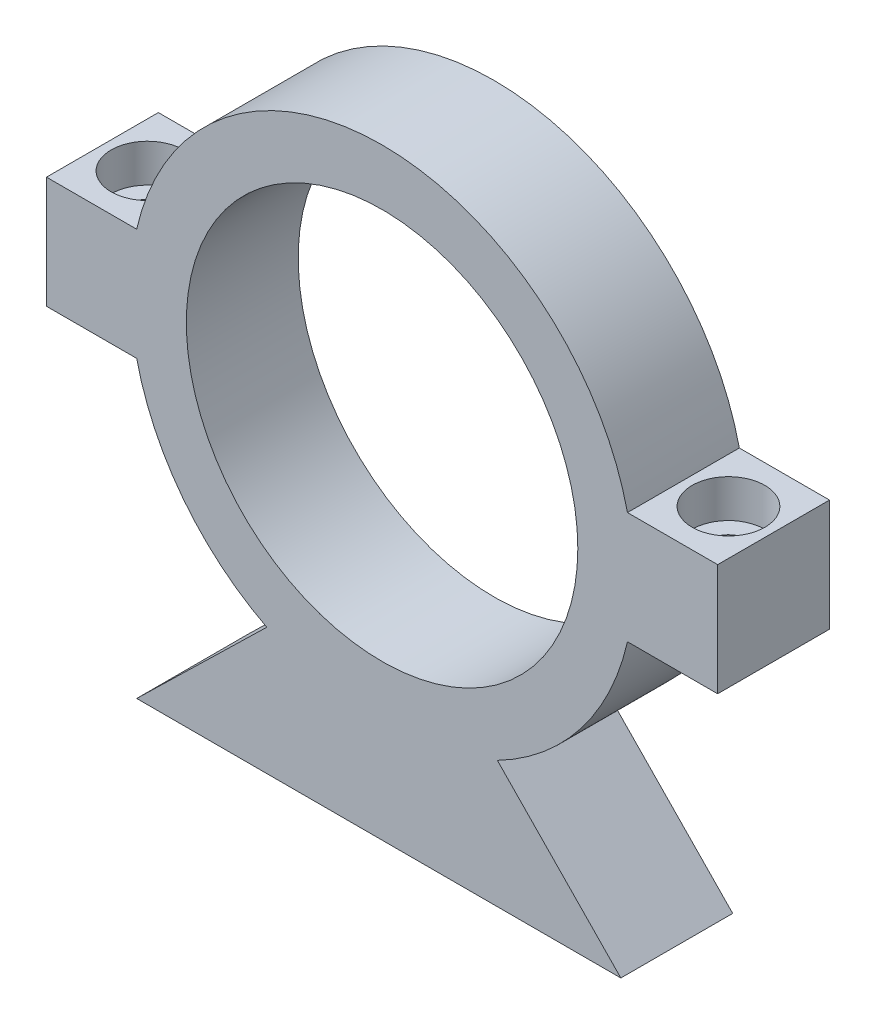
ISO-10303-21;
HEADER;
FILE_DESCRIPTION(('STEP AP214'),'2;1');
FILE_NAME('part.step','',(''),(''),'','','');
FILE_SCHEMA(('AUTOMOTIVE_DESIGN { 1 0 10303 214 1 1 1 1 }'));
ENDSEC;
DATA;
#1=APPLICATION_CONTEXT('core data for automotive mechanical design processes');
#2=APPLICATION_PROTOCOL_DEFINITION('international standard','automotive_design',2000,#1);
#3=PRODUCT_CONTEXT('',#1,'mechanical');
#4=PRODUCT('Part','Part','',(#3));
#5=PRODUCT_RELATED_PRODUCT_CATEGORY('part','',(#4));
#6=PRODUCT_DEFINITION_FORMATION('','',#4);
#7=PRODUCT_DEFINITION_CONTEXT('part definition',#1,'design');
#8=PRODUCT_DEFINITION('design','',#6,#7);
#9=PRODUCT_DEFINITION_SHAPE('','',#8);
#10=(LENGTH_UNIT() NAMED_UNIT(*) SI_UNIT(.MILLI.,.METRE.));
#11=(NAMED_UNIT(*) PLANE_ANGLE_UNIT() SI_UNIT($,.RADIAN.));
#12=(NAMED_UNIT(*) SI_UNIT($,.STERADIAN.) SOLID_ANGLE_UNIT());
#13=UNCERTAINTY_MEASURE_WITH_UNIT(LENGTH_MEASURE(1.E-05),#10,'distance_accuracy_value','');
#14=(GEOMETRIC_REPRESENTATION_CONTEXT(3) GLOBAL_UNCERTAINTY_ASSIGNED_CONTEXT((#13)) GLOBAL_UNIT_ASSIGNED_CONTEXT((#10,
#11,#12)) REPRESENTATION_CONTEXT('',''));
#15=CARTESIAN_POINT('',(0.,0.,0.));
#16=DIRECTION('',(0.,0.,1.));
#17=DIRECTION('',(1.,0.,0.));
#18=AXIS2_PLACEMENT_3D('',#15,#16,#17);
#19=CARTESIAN_POINT('',(0.,0.,10.));
#20=DIRECTION('',(0.,0.,-1.));
#21=DIRECTION('',(-1.,0.,0.));
#22=AXIS2_PLACEMENT_3D('',#19,#20,#21);
#23=PLANE('',#22);
#24=CARTESIAN_POINT('',(0.,0.,10.));
#25=DIRECTION('',(0.,0.,1.));
#26=DIRECTION('',(-1.,0.,0.));
#27=AXIS2_PLACEMENT_3D('',#24,#25,#26);
#28=CIRCLE('',#27,22.5);
#29=CARTESIAN_POINT('',(10.3077640640442,-20.,10.));
#30=VERTEX_POINT('',#29);
#31=CARTESIAN_POINT('',(21.9374109684803,-5.,10.));
#32=VERTEX_POINT('',#31);
#33=EDGE_CURVE('E179',#30,#32,#28,.T.);
#34=ORIENTED_EDGE('',*,*,#33,.T.);
#35=DIRECTION('',(1.,0.,0.));
#36=VECTOR('',#35,1.);
#37=CARTESIAN_POINT('',(29.9999999999999,-5.,10.));
#38=LINE('',#37,#36);
#39=CARTESIAN_POINT('',(29.9999999999999,-5.,10.));
#40=VERTEX_POINT('',#39);
#41=EDGE_CURVE('E107',#32,#40,#38,.T.);
#42=ORIENTED_EDGE('',*,*,#41,.T.);
#43=DIRECTION('',(0.,1.,0.));
#44=VECTOR('',#43,1.);
#45=CARTESIAN_POINT('',(29.9999999999999,-5.,10.));
#46=LINE('',#45,#44);
#47=CARTESIAN_POINT('',(30.,5.,10.));
#48=VERTEX_POINT('',#47);
#49=EDGE_CURVE('E224',#40,#48,#46,.T.);
#50=ORIENTED_EDGE('',*,*,#49,.T.);
#51=DIRECTION('',(-1.,0.,0.));
#52=VECTOR('',#51,1.);
#53=CARTESIAN_POINT('',(30.,5.,10.));
#54=LINE('',#53,#52);
#55=CARTESIAN_POINT('',(21.9374109684803,5.,10.));
#56=VERTEX_POINT('',#55);
#57=EDGE_CURVE('E226',#48,#56,#54,.T.);
#58=ORIENTED_EDGE('',*,*,#57,.T.);
#59=CARTESIAN_POINT('',(0.,0.,10.));
#60=DIRECTION('',(0.,0.,1.));
#61=DIRECTION('',(1.,0.,0.));
#62=AXIS2_PLACEMENT_3D('',#59,#60,#61);
#63=CIRCLE('',#62,22.5);
#64=CARTESIAN_POINT('',(-21.9374109684803,4.99999999999999,10.));
#65=VERTEX_POINT('',#64);
#66=EDGE_CURVE('E228',#56,#65,#63,.T.);
#67=ORIENTED_EDGE('',*,*,#66,.T.);
#68=DIRECTION('',(-1.,0.,0.));
#69=VECTOR('',#68,1.);
#70=CARTESIAN_POINT('',(-30.,5.,10.));
#71=LINE('',#70,#69);
#72=CARTESIAN_POINT('',(-30.,5.,10.));
#73=VERTEX_POINT('',#72);
#74=EDGE_CURVE('E230',#65,#73,#71,.T.);
#75=ORIENTED_EDGE('',*,*,#74,.T.);
#76=DIRECTION('',(0.,-1.,0.));
#77=VECTOR('',#76,1.);
#78=CARTESIAN_POINT('',(-30.,-5.,10.));
#79=LINE('',#78,#77);
#80=CARTESIAN_POINT('',(-30.,-5.,10.));
#81=VERTEX_POINT('',#80);
#82=EDGE_CURVE('E232',#73,#81,#79,.T.);
#83=ORIENTED_EDGE('',*,*,#82,.T.);
#84=DIRECTION('',(1.,0.,0.));
#85=VECTOR('',#84,1.);
#86=CARTESIAN_POINT('',(-30.,-5.,10.));
#87=LINE('',#86,#85);
#88=CARTESIAN_POINT('',(-21.9374109684803,-5.,10.));
#89=VERTEX_POINT('',#88);
#90=EDGE_CURVE('E234',#81,#89,#87,.T.);
#91=ORIENTED_EDGE('',*,*,#90,.T.);
#92=CARTESIAN_POINT('',(0.,0.,10.));
#93=DIRECTION('',(0.,0.,1.));
#94=DIRECTION('',(-1.,0.,0.));
#95=AXIS2_PLACEMENT_3D('',#92,#93,#94);
#96=CIRCLE('',#95,22.5);
#97=CARTESIAN_POINT('',(-10.3077640640442,-20.,10.));
#98=VERTEX_POINT('',#97);
#99=EDGE_CURVE('E138',#89,#98,#96,.T.);
#100=ORIENTED_EDGE('',*,*,#99,.T.);
#101=DIRECTION('',(-0.716274250186182,-0.697818886617597,0.));
#102=VECTOR('',#101,1.);
#103=CARTESIAN_POINT('',(-10.3077640640442,-20.,10.));
#104=LINE('',#103,#102);
#105=CARTESIAN_POINT('',(-21.9374109684803,-31.33,10.));
#106=VERTEX_POINT('',#105);
#107=EDGE_CURVE('E132',#98,#106,#104,.T.);
#108=ORIENTED_EDGE('',*,*,#107,.T.);
#109=DIRECTION('',(1.,0.,0.));
#110=VECTOR('',#109,1.);
#111=CARTESIAN_POINT('',(-21.9374109684803,-31.33,10.));
#112=LINE('',#111,#110);
#113=CARTESIAN_POINT('',(21.3458377953311,-31.33,10.));
#114=VERTEX_POINT('',#113);
#115=EDGE_CURVE('E136',#106,#114,#112,.T.);
#116=ORIENTED_EDGE('',*,*,#115,.T.);
#117=DIRECTION('',(-0.697818886617597,0.716274250186182,0.));
#118=VECTOR('',#117,1.);
#119=CARTESIAN_POINT('',(21.3458377953311,-31.33,10.));
#120=LINE('',#119,#118);
#121=EDGE_CURVE('E52',#114,#30,#120,.T.);
#122=ORIENTED_EDGE('',*,*,#121,.T.);
#123=EDGE_LOOP('',(#34,#42,#50,#58,#67,#75,#83,#91,#100,#108,#116,#122));
#124=FACE_BOUND('',#123,.T.);
#125=CARTESIAN_POINT('',(0.,0.,10.));
#126=DIRECTION('',(0.,0.,1.));
#127=DIRECTION('',(1.,0.,0.));
#128=AXIS2_PLACEMENT_3D('',#125,#126,#127);
#129=CIRCLE('',#128,17.5);
#130=CARTESIAN_POINT('',(17.5,0.,10.));
#131=VERTEX_POINT('',#130);
#132=EDGE_CURVE('E160',#131,#131,#129,.T.);
#133=ORIENTED_EDGE('',*,*,#132,.F.);
#134=EDGE_LOOP('',(#133));
#135=FACE_BOUND('',#134,.T.);
#136=ADVANCED_FACE('F33',(#124,#135),#23,.F.);
#137=CARTESIAN_POINT('',(0.,0.,0.));
#138=DIRECTION('',(0.,0.,-1.));
#139=DIRECTION('',(-1.,0.,0.));
#140=AXIS2_PLACEMENT_3D('',#137,#138,#139);
#141=PLANE('',#140);
#142=CARTESIAN_POINT('',(0.,0.,0.));
#143=DIRECTION('',(0.,0.,1.));
#144=DIRECTION('',(-1.,0.,0.));
#145=AXIS2_PLACEMENT_3D('',#142,#143,#144);
#146=CIRCLE('',#145,22.5);
#147=CARTESIAN_POINT('',(10.3077640640442,-20.,0.));
#148=VERTEX_POINT('',#147);
#149=CARTESIAN_POINT('',(21.9374109684803,-5.,0.));
#150=VERTEX_POINT('',#149);
#151=EDGE_CURVE('E156',#148,#150,#146,.T.);
#152=ORIENTED_EDGE('',*,*,#151,.F.);
#153=DIRECTION('',(-0.697818886617597,0.716274250186182,0.));
#154=VECTOR('',#153,1.);
#155=CARTESIAN_POINT('',(21.3458377953311,-31.33,0.));
#156=LINE('',#155,#154);
#157=CARTESIAN_POINT('',(21.3458377953311,-31.33,0.));
#158=VERTEX_POINT('',#157);
#159=EDGE_CURVE('E99',#158,#148,#156,.T.);
#160=ORIENTED_EDGE('',*,*,#159,.F.);
#161=DIRECTION('',(1.,0.,0.));
#162=VECTOR('',#161,1.);
#163=CARTESIAN_POINT('',(-21.9374109684803,-31.33,0.));
#164=LINE('',#163,#162);
#165=CARTESIAN_POINT('',(-21.9374109684803,-31.33,0.));
#166=VERTEX_POINT('',#165);
#167=EDGE_CURVE('E93',#166,#158,#164,.T.);
#168=ORIENTED_EDGE('',*,*,#167,.F.);
#169=DIRECTION('',(-0.716274250186182,-0.697818886617597,0.));
#170=VECTOR('',#169,1.);
#171=CARTESIAN_POINT('',(-10.3077640640442,-20.,0.));
#172=LINE('',#171,#170);
#173=CARTESIAN_POINT('',(-10.3077640640442,-20.,0.));
#174=VERTEX_POINT('',#173);
#175=EDGE_CURVE('E146',#174,#166,#172,.T.);
#176=ORIENTED_EDGE('',*,*,#175,.F.);
#177=CARTESIAN_POINT('',(0.,0.,0.));
#178=DIRECTION('',(0.,0.,1.));
#179=DIRECTION('',(-1.,0.,0.));
#180=AXIS2_PLACEMENT_3D('',#177,#178,#179);
#181=CIRCLE('',#180,22.5);
#182=CARTESIAN_POINT('',(-21.9374109684803,-5.,0.));
#183=VERTEX_POINT('',#182);
#184=EDGE_CURVE('E174',#183,#174,#181,.T.);
#185=ORIENTED_EDGE('',*,*,#184,.F.);
#186=DIRECTION('',(1.,0.,0.));
#187=VECTOR('',#186,1.);
#188=CARTESIAN_POINT('',(-30.,-5.,0.));
#189=LINE('',#188,#187);
#190=CARTESIAN_POINT('',(-30.,-5.,0.));
#191=VERTEX_POINT('',#190);
#192=EDGE_CURVE('E172',#191,#183,#189,.T.);
#193=ORIENTED_EDGE('',*,*,#192,.F.);
#194=DIRECTION('',(0.,-1.,0.));
#195=VECTOR('',#194,1.);
#196=CARTESIAN_POINT('',(-30.,-5.,0.));
#197=LINE('',#196,#195);
#198=CARTESIAN_POINT('',(-30.,5.,0.));
#199=VERTEX_POINT('',#198);
#200=EDGE_CURVE('E170',#199,#191,#197,.T.);
#201=ORIENTED_EDGE('',*,*,#200,.F.);
#202=DIRECTION('',(-1.,0.,0.));
#203=VECTOR('',#202,1.);
#204=CARTESIAN_POINT('',(-30.,5.,0.));
#205=LINE('',#204,#203);
#206=CARTESIAN_POINT('',(-21.9374109684803,4.99999999999999,0.));
#207=VERTEX_POINT('',#206);
#208=EDGE_CURVE('E168',#207,#199,#205,.T.);
#209=ORIENTED_EDGE('',*,*,#208,.F.);
#210=CARTESIAN_POINT('',(0.,0.,0.));
#211=DIRECTION('',(0.,0.,1.));
#212=DIRECTION('',(1.,0.,0.));
#213=AXIS2_PLACEMENT_3D('',#210,#211,#212);
#214=CIRCLE('',#213,22.5);
#215=CARTESIAN_POINT('',(21.9374109684803,5.,0.));
#216=VERTEX_POINT('',#215);
#217=EDGE_CURVE('E166',#216,#207,#214,.T.);
#218=ORIENTED_EDGE('',*,*,#217,.F.);
#219=DIRECTION('',(-1.,0.,0.));
#220=VECTOR('',#219,1.);
#221=CARTESIAN_POINT('',(30.,5.,0.));
#222=LINE('',#221,#220);
#223=CARTESIAN_POINT('',(30.,5.,0.));
#224=VERTEX_POINT('',#223);
#225=EDGE_CURVE('E164',#224,#216,#222,.T.);
#226=ORIENTED_EDGE('',*,*,#225,.F.);
#227=DIRECTION('',(0.,1.,0.));
#228=VECTOR('',#227,1.);
#229=CARTESIAN_POINT('',(29.9999999999999,-5.,0.));
#230=LINE('',#229,#228);
#231=CARTESIAN_POINT('',(29.9999999999999,-5.,0.));
#232=VERTEX_POINT('',#231);
#233=EDGE_CURVE('E162',#232,#224,#230,.T.);
#234=ORIENTED_EDGE('',*,*,#233,.F.);
#235=DIRECTION('',(1.,0.,0.));
#236=VECTOR('',#235,1.);
#237=CARTESIAN_POINT('',(29.9999999999999,-5.,0.));
#238=LINE('',#237,#236);
#239=EDGE_CURVE('E159',#150,#232,#238,.T.);
#240=ORIENTED_EDGE('',*,*,#239,.F.);
#241=EDGE_LOOP('',(#152,#160,#168,#176,#185,#193,#201,#209,#218,#226,#234,#240));
#242=FACE_BOUND('',#241,.T.);
#243=CARTESIAN_POINT('',(0.,0.,0.));
#244=DIRECTION('',(0.,0.,1.));
#245=DIRECTION('',(1.,0.,0.));
#246=AXIS2_PLACEMENT_3D('',#243,#244,#245);
#247=CIRCLE('',#246,17.5);
#248=CARTESIAN_POINT('',(17.5,0.,0.));
#249=VERTEX_POINT('',#248);
#250=EDGE_CURVE('E204',#249,#249,#247,.T.);
#251=ORIENTED_EDGE('',*,*,#250,.T.);
#252=EDGE_LOOP('',(#251));
#253=FACE_BOUND('',#252,.T.);
#254=ADVANCED_FACE('F247',(#242,#253),#141,.T.);
#255=CARTESIAN_POINT('',(0.,0.,10.));
#256=DIRECTION('',(0.,0.,-1.));
#257=DIRECTION('',(-1.,0.,0.));
#258=AXIS2_PLACEMENT_3D('',#255,#256,#257);
#259=CYLINDRICAL_SURFACE('',#258,22.5);
#260=ORIENTED_EDGE('',*,*,#151,.T.);
#261=DIRECTION('',(0.,0.,-1.));
#262=VECTOR('',#261,1.);
#263=CARTESIAN_POINT('',(21.9374109684803,-5.,10.));
#264=LINE('',#263,#262);
#265=EDGE_CURVE('E11',#32,#150,#264,.T.);
#266=ORIENTED_EDGE('',*,*,#265,.F.);
#267=ORIENTED_EDGE('',*,*,#33,.F.);
#268=DIRECTION('',(0.,0.,-1.));
#269=VECTOR('',#268,1.);
#270=CARTESIAN_POINT('',(10.3077640640442,-20.,10.));
#271=LINE('',#270,#269);
#272=EDGE_CURVE('E152',#30,#148,#271,.T.);
#273=ORIENTED_EDGE('',*,*,#272,.T.);
#274=EDGE_LOOP('',(#260,#266,#267,#273));
#275=FACE_BOUND('',#274,.T.);
#276=ADVANCED_FACE('F35',(#275),#259,.T.);
#277=CARTESIAN_POINT('',(29.9999999999999,-5.,10.));
#278=DIRECTION('',(0.,1.,0.));
#279=DIRECTION('',(-1.,0.,0.));
#280=AXIS2_PLACEMENT_3D('',#277,#278,#279);
#281=PLANE('',#280);
#282=CARTESIAN_POINT('',(25.97,-5.,5.));
#283=DIRECTION('',(0.,1.,0.));
#284=DIRECTION('',(-1.,0.,0.));
#285=AXIS2_PLACEMENT_3D('',#282,#283,#284);
#286=CIRCLE('',#285,1.69999999999999);
#287=CARTESIAN_POINT('',(24.27,-5.,5.));
#288=VERTEX_POINT('',#287);
#289=EDGE_CURVE('E202',#288,#288,#286,.T.);
#290=ORIENTED_EDGE('',*,*,#289,.T.);
#291=EDGE_LOOP('',(#290));
#292=FACE_BOUND('',#291,.T.);
#293=ORIENTED_EDGE('',*,*,#239,.T.);
#294=DIRECTION('',(0.,0.,-1.));
#295=VECTOR('',#294,1.);
#296=CARTESIAN_POINT('',(29.9999999999999,-5.,10.));
#297=LINE('',#296,#295);
#298=EDGE_CURVE('E43',#40,#232,#297,.T.);
#299=ORIENTED_EDGE('',*,*,#298,.F.);
#300=ORIENTED_EDGE('',*,*,#41,.F.);
#301=ORIENTED_EDGE('',*,*,#265,.T.);
#302=EDGE_LOOP('',(#293,#299,#300,#301));
#303=FACE_BOUND('',#302,.T.);
#304=ADVANCED_FACE('F340',(#292,#303),#281,.F.);
#305=CARTESIAN_POINT('',(29.9999999999999,-5.,10.));
#306=DIRECTION('',(-1.,0.,0.));
#307=DIRECTION('',(0.,-1.,0.));
#308=AXIS2_PLACEMENT_3D('',#305,#306,#307);
#309=PLANE('',#308);
#310=ORIENTED_EDGE('',*,*,#233,.T.);
#311=DIRECTION('',(0.,0.,-1.));
#312=VECTOR('',#311,1.);
#313=CARTESIAN_POINT('',(30.,5.,10.));
#314=LINE('',#313,#312);
#315=EDGE_CURVE('E198',#48,#224,#314,.T.);
#316=ORIENTED_EDGE('',*,*,#315,.F.);
#317=ORIENTED_EDGE('',*,*,#49,.F.);
#318=ORIENTED_EDGE('',*,*,#298,.T.);
#319=EDGE_LOOP('',(#310,#316,#317,#318));
#320=FACE_BOUND('',#319,.T.);
#321=ADVANCED_FACE('F337',(#320),#309,.F.);
#322=CARTESIAN_POINT('',(30.,5.,10.));
#323=DIRECTION('',(0.,-1.,0.));
#324=DIRECTION('',(1.,0.,0.));
#325=AXIS2_PLACEMENT_3D('',#322,#323,#324);
#326=PLANE('',#325);
#327=CARTESIAN_POINT('',(25.97,5.,5.));
#328=DIRECTION('',(0.,1.,0.));
#329=DIRECTION('',(0.,0.,1.));
#330=AXIS2_PLACEMENT_3D('',#327,#328,#329);
#331=CIRCLE('',#330,3.25);
#332=CARTESIAN_POINT('',(25.97,5.,8.25));
#333=VERTEX_POINT('',#332);
#334=EDGE_CURVE('E216',#333,#333,#331,.T.);
#335=ORIENTED_EDGE('',*,*,#334,.F.);
#336=EDGE_LOOP('',(#335));
#337=FACE_BOUND('',#336,.T.);
#338=ORIENTED_EDGE('',*,*,#225,.T.);
#339=DIRECTION('',(0.,0.,-1.));
#340=VECTOR('',#339,1.);
#341=CARTESIAN_POINT('',(21.9374109684803,5.,10.));
#342=LINE('',#341,#340);
#343=EDGE_CURVE('E195',#56,#216,#342,.T.);
#344=ORIENTED_EDGE('',*,*,#343,.F.);
#345=ORIENTED_EDGE('',*,*,#57,.F.);
#346=ORIENTED_EDGE('',*,*,#315,.T.);
#347=EDGE_LOOP('',(#338,#344,#345,#346));
#348=FACE_BOUND('',#347,.T.);
#349=ADVANCED_FACE('F333',(#337,#348),#326,.F.);
#350=CARTESIAN_POINT('',(0.,0.,10.));
#351=DIRECTION('',(0.,0.,-1.));
#352=DIRECTION('',(-1.,0.,0.));
#353=AXIS2_PLACEMENT_3D('',#350,#351,#352);
#354=CYLINDRICAL_SURFACE('',#353,22.5);
#355=ORIENTED_EDGE('',*,*,#217,.T.);
#356=DIRECTION('',(0.,0.,-1.));
#357=VECTOR('',#356,1.);
#358=CARTESIAN_POINT('',(-21.9374109684803,4.99999999999999,10.));
#359=LINE('',#358,#357);
#360=EDGE_CURVE('E192',#65,#207,#359,.T.);
#361=ORIENTED_EDGE('',*,*,#360,.F.);
#362=ORIENTED_EDGE('',*,*,#66,.F.);
#363=ORIENTED_EDGE('',*,*,#343,.T.);
#364=EDGE_LOOP('',(#355,#361,#362,#363));
#365=FACE_BOUND('',#364,.T.);
#366=ADVANCED_FACE('F330',(#365),#354,.T.);
#367=CARTESIAN_POINT('',(-30.,5.,10.));
#368=DIRECTION('',(0.,-1.,0.));
#369=DIRECTION('',(1.,0.,0.));
#370=AXIS2_PLACEMENT_3D('',#367,#368,#369);
#371=PLANE('',#370);
#372=CARTESIAN_POINT('',(-25.97,5.,5.));
#373=DIRECTION('',(0.,1.,0.));
#374=DIRECTION('',(0.,0.,1.));
#375=AXIS2_PLACEMENT_3D('',#372,#373,#374);
#376=CIRCLE('',#375,3.25);
#377=CARTESIAN_POINT('',(-25.97,5.,8.25));
#378=VERTEX_POINT('',#377);
#379=EDGE_CURVE('E301',#378,#378,#376,.T.);
#380=ORIENTED_EDGE('',*,*,#379,.F.);
#381=EDGE_LOOP('',(#380));
#382=FACE_BOUND('',#381,.T.);
#383=ORIENTED_EDGE('',*,*,#208,.T.);
#384=DIRECTION('',(0.,0.,-1.));
#385=VECTOR('',#384,1.);
#386=CARTESIAN_POINT('',(-30.,5.,10.));
#387=LINE('',#386,#385);
#388=EDGE_CURVE('E189',#73,#199,#387,.T.);
#389=ORIENTED_EDGE('',*,*,#388,.F.);
#390=ORIENTED_EDGE('',*,*,#74,.F.);
#391=ORIENTED_EDGE('',*,*,#360,.T.);
#392=EDGE_LOOP('',(#383,#389,#390,#391));
#393=FACE_BOUND('',#392,.T.);
#394=ADVANCED_FACE('F323',(#382,#393),#371,.F.);
#395=CARTESIAN_POINT('',(-30.,-5.,10.));
#396=DIRECTION('',(1.,0.,0.));
#397=DIRECTION('',(0.,1.,0.));
#398=AXIS2_PLACEMENT_3D('',#395,#396,#397);
#399=PLANE('',#398);
#400=ORIENTED_EDGE('',*,*,#200,.T.);
#401=DIRECTION('',(0.,0.,-1.));
#402=VECTOR('',#401,1.);
#403=CARTESIAN_POINT('',(-30.,-5.,10.));
#404=LINE('',#403,#402);
#405=EDGE_CURVE('E186',#81,#191,#404,.T.);
#406=ORIENTED_EDGE('',*,*,#405,.F.);
#407=ORIENTED_EDGE('',*,*,#82,.F.);
#408=ORIENTED_EDGE('',*,*,#388,.T.);
#409=EDGE_LOOP('',(#400,#406,#407,#408));
#410=FACE_BOUND('',#409,.T.);
#411=ADVANCED_FACE('F316',(#410),#399,.F.);
#412=CARTESIAN_POINT('',(-30.,-5.,10.));
#413=DIRECTION('',(0.,1.,0.));
#414=DIRECTION('',(-1.,0.,0.));
#415=AXIS2_PLACEMENT_3D('',#412,#413,#414);
#416=PLANE('',#415);
#417=CARTESIAN_POINT('',(-25.97,-5.,5.));
#418=DIRECTION('',(0.,1.,0.));
#419=DIRECTION('',(-1.,0.,0.));
#420=AXIS2_PLACEMENT_3D('',#417,#418,#419);
#421=CIRCLE('',#420,1.69999999999999);
#422=CARTESIAN_POINT('',(-27.67,-5.,5.));
#423=VERTEX_POINT('',#422);
#424=EDGE_CURVE('E37',#423,#423,#421,.T.);
#425=ORIENTED_EDGE('',*,*,#424,.T.);
#426=EDGE_LOOP('',(#425));
#427=FACE_BOUND('',#426,.T.);
#428=ORIENTED_EDGE('',*,*,#192,.T.);
#429=DIRECTION('',(0.,0.,-1.));
#430=VECTOR('',#429,1.);
#431=CARTESIAN_POINT('',(-21.9374109684803,-5.,10.));
#432=LINE('',#431,#430);
#433=EDGE_CURVE('E183',#89,#183,#432,.T.);
#434=ORIENTED_EDGE('',*,*,#433,.F.);
#435=ORIENTED_EDGE('',*,*,#90,.F.);
#436=ORIENTED_EDGE('',*,*,#405,.T.);
#437=EDGE_LOOP('',(#428,#434,#435,#436));
#438=FACE_BOUND('',#437,.T.);
#439=ADVANCED_FACE('F240',(#427,#438),#416,.F.);
#440=CARTESIAN_POINT('',(0.,0.,10.));
#441=DIRECTION('',(0.,0.,-1.));
#442=DIRECTION('',(-1.,0.,0.));
#443=AXIS2_PLACEMENT_3D('',#440,#441,#442);
#444=CYLINDRICAL_SURFACE('',#443,22.5);
#445=ORIENTED_EDGE('',*,*,#184,.T.);
#446=DIRECTION('',(0.,0.,-1.));
#447=VECTOR('',#446,1.);
#448=CARTESIAN_POINT('',(-10.3077640640442,-20.,10.));
#449=LINE('',#448,#447);
#450=EDGE_CURVE('E147',#98,#174,#449,.T.);
#451=ORIENTED_EDGE('',*,*,#450,.F.);
#452=ORIENTED_EDGE('',*,*,#99,.F.);
#453=ORIENTED_EDGE('',*,*,#433,.T.);
#454=EDGE_LOOP('',(#445,#451,#452,#453));
#455=FACE_BOUND('',#454,.T.);
#456=ADVANCED_FACE('F244',(#455),#444,.T.);
#457=CARTESIAN_POINT('',(-10.3077640640442,-20.,10.));
#458=DIRECTION('',(0.697818886617597,-0.716274250186182,0.));
#459=DIRECTION('',(0.716274250186182,0.697818886617597,0.));
#460=AXIS2_PLACEMENT_3D('',#457,#458,#459);
#461=PLANE('',#460);
#462=ORIENTED_EDGE('',*,*,#175,.T.);
#463=DIRECTION('',(0.,0.,-1.));
#464=VECTOR('',#463,1.);
#465=CARTESIAN_POINT('',(-21.9374109684803,-31.33,10.));
#466=LINE('',#465,#464);
#467=EDGE_CURVE('E143',#106,#166,#466,.T.);
#468=ORIENTED_EDGE('',*,*,#467,.F.);
#469=ORIENTED_EDGE('',*,*,#107,.F.);
#470=ORIENTED_EDGE('',*,*,#450,.T.);
#471=EDGE_LOOP('',(#462,#468,#469,#470));
#472=FACE_BOUND('',#471,.T.);
#473=ADVANCED_FACE('F144',(#472),#461,.F.);
#474=CARTESIAN_POINT('',(-21.9374109684803,-31.33,10.));
#475=DIRECTION('',(0.,1.,0.));
#476=DIRECTION('',(0.,0.,1.));
#477=AXIS2_PLACEMENT_3D('',#474,#475,#476);
#478=PLANE('',#477);
#479=ORIENTED_EDGE('',*,*,#167,.T.);
#480=DIRECTION('',(0.,0.,-1.));
#481=VECTOR('',#480,1.);
#482=CARTESIAN_POINT('',(21.3458377953311,-31.33,10.));
#483=LINE('',#482,#481);
#484=EDGE_CURVE('E148',#114,#158,#483,.T.);
#485=ORIENTED_EDGE('',*,*,#484,.F.);
#486=ORIENTED_EDGE('',*,*,#115,.F.);
#487=ORIENTED_EDGE('',*,*,#467,.T.);
#488=EDGE_LOOP('',(#479,#485,#486,#487));
#489=FACE_BOUND('',#488,.T.);
#490=ADVANCED_FACE('F150',(#489),#478,.F.);
#491=CARTESIAN_POINT('',(21.3458377953311,-31.33,10.));
#492=DIRECTION('',(-0.716274250186182,-0.697818886617597,0.));
#493=DIRECTION('',(0.697818886617597,-0.716274250186182,0.));
#494=AXIS2_PLACEMENT_3D('',#491,#492,#493);
#495=PLANE('',#494);
#496=ORIENTED_EDGE('',*,*,#159,.T.);
#497=ORIENTED_EDGE('',*,*,#272,.F.);
#498=ORIENTED_EDGE('',*,*,#121,.F.);
#499=ORIENTED_EDGE('',*,*,#484,.T.);
#500=EDGE_LOOP('',(#496,#497,#498,#499));
#501=FACE_BOUND('',#500,.T.);
#502=ADVANCED_FACE('F253',(#501),#495,.F.);
#503=CARTESIAN_POINT('',(0.,0.,10.));
#504=DIRECTION('',(0.,0.,-1.));
#505=DIRECTION('',(-1.,0.,0.));
#506=AXIS2_PLACEMENT_3D('',#503,#504,#505);
#507=CYLINDRICAL_SURFACE('',#506,17.5);
#508=ORIENTED_EDGE('',*,*,#132,.T.);
#509=EDGE_LOOP('',(#508));
#510=FACE_BOUND('',#509,.T.);
#511=ORIENTED_EDGE('',*,*,#250,.F.);
#512=EDGE_LOOP('',(#511));
#513=FACE_BOUND('',#512,.T.);
#514=ADVANCED_FACE('F255',(#510,#513),#507,.F.);
#515=CARTESIAN_POINT('',(25.97,5.,5.));
#516=DIRECTION('',(0.,1.,0.));
#517=DIRECTION('',(0.,0.,1.));
#518=AXIS2_PLACEMENT_3D('',#515,#516,#517);
#519=CYLINDRICAL_SURFACE('',#518,1.69999999999999);
#520=CARTESIAN_POINT('',(25.97,1.6,5.));
#521=DIRECTION('',(0.,1.,0.));
#522=DIRECTION('',(0.,0.,1.));
#523=AXIS2_PLACEMENT_3D('',#520,#521,#522);
#524=CIRCLE('',#523,1.7);
#525=CARTESIAN_POINT('',(25.97,1.6,6.7));
#526=VERTEX_POINT('',#525);
#527=EDGE_CURVE('E205',#526,#526,#524,.T.);
#528=ORIENTED_EDGE('',*,*,#527,.T.);
#529=EDGE_LOOP('',(#528));
#530=FACE_BOUND('',#529,.T.);
#531=ORIENTED_EDGE('',*,*,#289,.F.);
#532=EDGE_LOOP('',(#531));
#533=FACE_BOUND('',#532,.T.);
#534=ADVANCED_FACE('F261',(#530,#533),#519,.F.);
#535=CARTESIAN_POINT('',(27.67,1.6,5.));
#536=DIRECTION('',(0.,-1.,0.));
#537=DIRECTION('',(0.,0.,-1.));
#538=AXIS2_PLACEMENT_3D('',#535,#536,#537);
#539=PLANE('',#538);
#540=ORIENTED_EDGE('',*,*,#527,.F.);
#541=EDGE_LOOP('',(#540));
#542=FACE_BOUND('',#541,.T.);
#543=CARTESIAN_POINT('',(25.97,1.6,5.));
#544=DIRECTION('',(0.,1.,0.));
#545=DIRECTION('',(0.,0.,1.));
#546=AXIS2_PLACEMENT_3D('',#543,#544,#545);
#547=CIRCLE('',#546,3.25);
#548=CARTESIAN_POINT('',(25.97,1.6,8.25));
#549=VERTEX_POINT('',#548);
#550=EDGE_CURVE('E211',#549,#549,#547,.T.);
#551=ORIENTED_EDGE('',*,*,#550,.T.);
#552=EDGE_LOOP('',(#551));
#553=FACE_BOUND('',#552,.T.);
#554=ADVANCED_FACE('F274',(#542,#553),#539,.F.);
#555=CARTESIAN_POINT('',(25.97,5.,5.));
#556=DIRECTION('',(0.,1.,0.));
#557=DIRECTION('',(0.,0.,1.));
#558=AXIS2_PLACEMENT_3D('',#555,#556,#557);
#559=CYLINDRICAL_SURFACE('',#558,3.25);
#560=ORIENTED_EDGE('',*,*,#550,.F.);
#561=EDGE_LOOP('',(#560));
#562=FACE_BOUND('',#561,.T.);
#563=ORIENTED_EDGE('',*,*,#334,.T.);
#564=EDGE_LOOP('',(#563));
#565=FACE_BOUND('',#564,.T.);
#566=ADVANCED_FACE('F277',(#562,#565),#559,.F.);
#567=CARTESIAN_POINT('',(-25.97,5.,5.));
#568=DIRECTION('',(0.,1.,0.));
#569=DIRECTION('',(0.,0.,1.));
#570=AXIS2_PLACEMENT_3D('',#567,#568,#569);
#571=CYLINDRICAL_SURFACE('',#570,1.69999999999999);
#572=CARTESIAN_POINT('',(-25.97,1.6,5.));
#573=DIRECTION('',(0.,1.,0.));
#574=DIRECTION('',(0.,0.,1.));
#575=AXIS2_PLACEMENT_3D('',#572,#573,#574);
#576=CIRCLE('',#575,1.7);
#577=CARTESIAN_POINT('',(-25.97,1.6,6.7));
#578=VERTEX_POINT('',#577);
#579=EDGE_CURVE('E304',#578,#578,#576,.T.);
#580=ORIENTED_EDGE('',*,*,#579,.T.);
#581=EDGE_LOOP('',(#580));
#582=FACE_BOUND('',#581,.T.);
#583=ORIENTED_EDGE('',*,*,#424,.F.);
#584=EDGE_LOOP('',(#583));
#585=FACE_BOUND('',#584,.T.);
#586=ADVANCED_FACE('F281',(#582,#585),#571,.F.);
#587=CARTESIAN_POINT('',(-24.27,1.6,5.));
#588=DIRECTION('',(0.,-1.,0.));
#589=DIRECTION('',(0.,0.,-1.));
#590=AXIS2_PLACEMENT_3D('',#587,#588,#589);
#591=PLANE('',#590);
#592=ORIENTED_EDGE('',*,*,#579,.F.);
#593=EDGE_LOOP('',(#592));
#594=FACE_BOUND('',#593,.T.);
#595=CARTESIAN_POINT('',(-25.97,1.6,5.));
#596=DIRECTION('',(0.,1.,0.));
#597=DIRECTION('',(0.,0.,1.));
#598=AXIS2_PLACEMENT_3D('',#595,#596,#597);
#599=CIRCLE('',#598,3.25);
#600=CARTESIAN_POINT('',(-25.97,1.6,8.25));
#601=VERTEX_POINT('',#600);
#602=EDGE_CURVE('E298',#601,#601,#599,.T.);
#603=ORIENTED_EDGE('',*,*,#602,.T.);
#604=EDGE_LOOP('',(#603));
#605=FACE_BOUND('',#604,.T.);
#606=ADVANCED_FACE('F285',(#594,#605),#591,.F.);
#607=CARTESIAN_POINT('',(-25.97,5.,5.));
#608=DIRECTION('',(0.,1.,0.));
#609=DIRECTION('',(0.,0.,1.));
#610=AXIS2_PLACEMENT_3D('',#607,#608,#609);
#611=CYLINDRICAL_SURFACE('',#610,3.25);
#612=ORIENTED_EDGE('',*,*,#602,.F.);
#613=EDGE_LOOP('',(#612));
#614=FACE_BOUND('',#613,.T.);
#615=ORIENTED_EDGE('',*,*,#379,.T.);
#616=EDGE_LOOP('',(#615));
#617=FACE_BOUND('',#616,.T.);
#618=ADVANCED_FACE('F289',(#614,#617),#611,.F.);
#619=CLOSED_SHELL('',(#136,#254,#276,#304,#321,#349,#366,#394,#411,#439,#456,#473,#490,#502,
#514,#534,#554,#566,#586,#606,#618));
#620=MANIFOLD_SOLID_BREP('B2',#619);
#621=ADVANCED_BREP_SHAPE_REPRESENTATION('',(#18,#620),#14);
#622=SHAPE_DEFINITION_REPRESENTATION(#9,#621);
ENDSEC;
END-ISO-10303-21;
